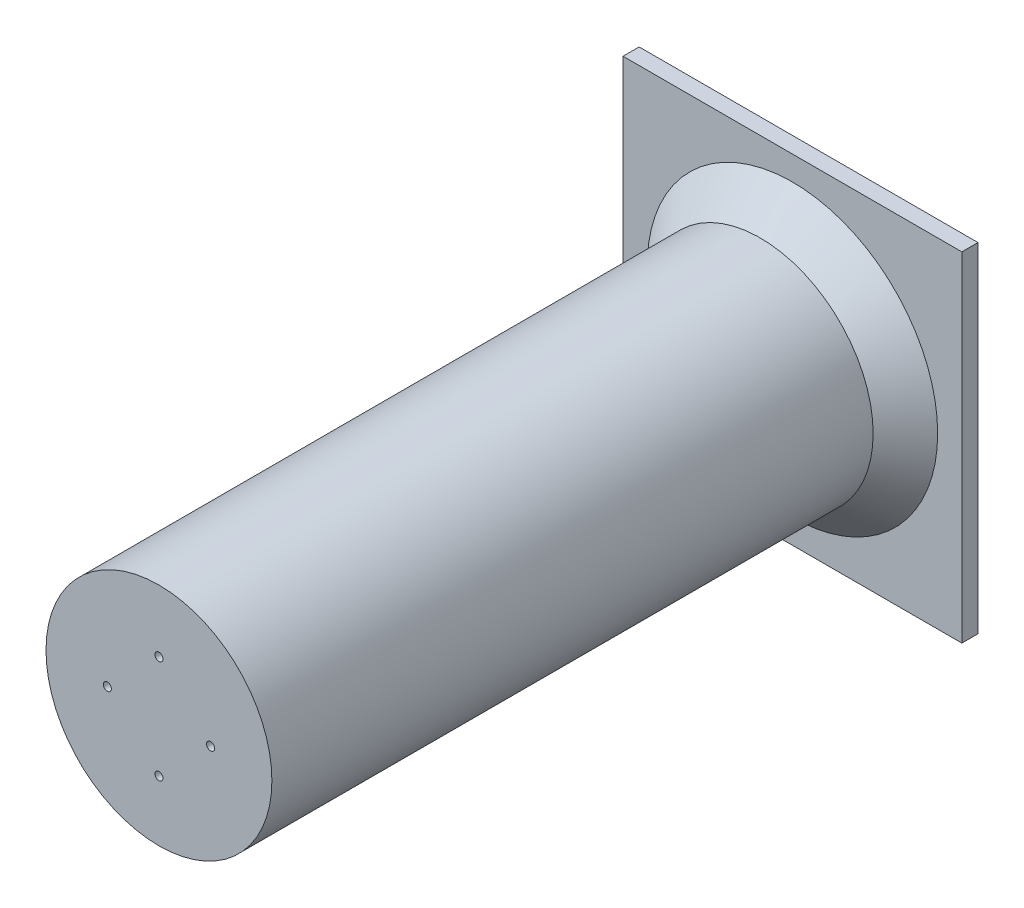
ISO-10303-21;
HEADER;
FILE_DESCRIPTION(('STEP AP214'),'2;1');
FILE_NAME('part.step','',(''),(''),'','','');
FILE_SCHEMA(('AUTOMOTIVE_DESIGN { 1 0 10303 214 1 1 1 1 }'));
ENDSEC;
DATA;
#1=APPLICATION_CONTEXT('core data for automotive mechanical design processes');
#2=APPLICATION_PROTOCOL_DEFINITION('international standard','automotive_design',2000,#1);
#3=PRODUCT_CONTEXT('',#1,'mechanical');
#4=PRODUCT('Part','Part','',(#3));
#5=PRODUCT_RELATED_PRODUCT_CATEGORY('part','',(#4));
#6=PRODUCT_DEFINITION_FORMATION('','',#4);
#7=PRODUCT_DEFINITION_CONTEXT('part definition',#1,'design');
#8=PRODUCT_DEFINITION('design','',#6,#7);
#9=PRODUCT_DEFINITION_SHAPE('','',#8);
#10=(LENGTH_UNIT() NAMED_UNIT(*) SI_UNIT(.MILLI.,.METRE.));
#11=(NAMED_UNIT(*) PLANE_ANGLE_UNIT() SI_UNIT($,.RADIAN.));
#12=(NAMED_UNIT(*) SI_UNIT($,.STERADIAN.) SOLID_ANGLE_UNIT());
#13=UNCERTAINTY_MEASURE_WITH_UNIT(LENGTH_MEASURE(1.E-05),#10,'distance_accuracy_value','');
#14=(GEOMETRIC_REPRESENTATION_CONTEXT(3) GLOBAL_UNCERTAINTY_ASSIGNED_CONTEXT((#13)) GLOBAL_UNIT_ASSIGNED_CONTEXT((#10,
#11,#12)) REPRESENTATION_CONTEXT('',''));
#15=CARTESIAN_POINT('',(0.,0.,0.));
#16=DIRECTION('',(0.,0.,1.));
#17=DIRECTION('',(1.,0.,0.));
#18=AXIS2_PLACEMENT_3D('',#15,#16,#17);
#19=CARTESIAN_POINT('',(-13.4317068131869,0.262679999999987,-196.5));
#20=DIRECTION('',(0.,0.,-1.));
#21=DIRECTION('',(-1.,0.,0.));
#22=AXIS2_PLACEMENT_3D('',#19,#20,#21);
#23=CONICAL_SURFACE('',#22,45.,0.785398163397448);
#24=CARTESIAN_POINT('',(-13.4317068131869,0.262679999999987,-196.5));
#25=DIRECTION('',(0.,0.,1.));
#26=DIRECTION('',(1.,0.,0.));
#27=AXIS2_PLACEMENT_3D('',#24,#25,#26);
#28=CIRCLE('',#27,45.);
#29=CARTESIAN_POINT('',(31.5682931868131,0.262679999999987,-196.5));
#30=VERTEX_POINT('',#29);
#31=EDGE_CURVE('E12',#30,#30,#28,.F.);
#32=ORIENTED_EDGE('',*,*,#31,.F.);
#33=EDGE_LOOP('',(#32));
#34=FACE_BOUND('',#33,.T.);
#35=CARTESIAN_POINT('',(-13.4317068131869,0.262679999999987,-186.5));
#36=DIRECTION('',(0.,0.,1.));
#37=DIRECTION('',(1.,0.,0.));
#38=AXIS2_PLACEMENT_3D('',#35,#36,#37);
#39=CIRCLE('',#38,35.);
#40=CARTESIAN_POINT('',(21.5682931868131,0.262679999999987,-186.5));
#41=VERTEX_POINT('',#40);
#42=EDGE_CURVE('E126',#41,#41,#39,.T.);
#43=ORIENTED_EDGE('',*,*,#42,.F.);
#44=EDGE_LOOP('',(#43));
#45=FACE_BOUND('',#44,.T.);
#46=ADVANCED_FACE('F49',(#34,#45),#23,.T.);
#47=CARTESIAN_POINT('',(-13.4317068131869,0.262679999999987,-196.5));
#48=DIRECTION('',(0.,0.,1.));
#49=DIRECTION('',(1.,0.,0.));
#50=AXIS2_PLACEMENT_3D('',#47,#48,#49);
#51=CYLINDRICAL_SURFACE('',#50,35.);
#52=CARTESIAN_POINT('',(-13.4317068131869,0.262679999999987,-0.186209333673831));
#53=DIRECTION('',(0.,0.,-1.));
#54=DIRECTION('',(-1.,0.,0.));
#55=AXIS2_PLACEMENT_3D('',#52,#53,#54);
#56=CIRCLE('',#55,35.);
#57=CARTESIAN_POINT('',(-48.431706813187,0.262679999999987,-0.186209333673831));
#58=VERTEX_POINT('',#57);
#59=EDGE_CURVE('E137',#58,#58,#56,.T.);
#60=ORIENTED_EDGE('',*,*,#59,.T.);
#61=EDGE_LOOP('',(#60));
#62=FACE_BOUND('',#61,.T.);
#63=ORIENTED_EDGE('',*,*,#42,.T.);
#64=EDGE_LOOP('',(#63));
#65=FACE_BOUND('',#64,.T.);
#66=ADVANCED_FACE('F170',(#62,#65),#51,.T.);
#67=CARTESIAN_POINT('',(-65.9317068131869,-52.23732,-201.5));
#68=DIRECTION('',(1.,0.,0.));
#69=DIRECTION('',(0.,0.,-1.));
#70=AXIS2_PLACEMENT_3D('',#67,#68,#69);
#71=PLANE('',#70);
#72=DIRECTION('',(0.,1.,0.));
#73=VECTOR('',#72,1.);
#74=CARTESIAN_POINT('',(-65.9317068131869,-52.23732,-196.5));
#75=LINE('',#74,#73);
#76=CARTESIAN_POINT('',(-65.9317068131869,-52.23732,-196.5));
#77=VERTEX_POINT('',#76);
#78=CARTESIAN_POINT('',(-65.9317068131869,52.76268,-196.5));
#79=VERTEX_POINT('',#78);
#80=EDGE_CURVE('E123',#77,#79,#75,.T.);
#81=ORIENTED_EDGE('',*,*,#80,.T.);
#82=DIRECTION('',(0.,0.,1.));
#83=VECTOR('',#82,1.);
#84=CARTESIAN_POINT('',(-65.9317068131869,52.76268,-201.5));
#85=LINE('',#84,#83);
#86=CARTESIAN_POINT('',(-65.9317068131869,52.76268,-201.5));
#87=VERTEX_POINT('',#86);
#88=EDGE_CURVE('E106',#87,#79,#85,.T.);
#89=ORIENTED_EDGE('',*,*,#88,.F.);
#90=DIRECTION('',(0.,1.,0.));
#91=VECTOR('',#90,1.);
#92=CARTESIAN_POINT('',(-65.9317068131869,-52.23732,-201.5));
#93=LINE('',#92,#91);
#94=CARTESIAN_POINT('',(-65.9317068131869,-52.23732,-201.5));
#95=VERTEX_POINT('',#94);
#96=EDGE_CURVE('E133',#95,#87,#93,.T.);
#97=ORIENTED_EDGE('',*,*,#96,.F.);
#98=DIRECTION('',(0.,0.,1.));
#99=VECTOR('',#98,1.);
#100=CARTESIAN_POINT('',(-65.9317068131869,-52.23732,-201.5));
#101=LINE('',#100,#99);
#102=EDGE_CURVE('E109',#95,#77,#101,.T.);
#103=ORIENTED_EDGE('',*,*,#102,.T.);
#104=EDGE_LOOP('',(#81,#89,#97,#103));
#105=FACE_BOUND('',#104,.T.);
#106=ADVANCED_FACE('F173',(#105),#71,.F.);
#107=CARTESIAN_POINT('',(39.0682931868131,52.76268,-201.5));
#108=DIRECTION('',(0.,-1.,0.));
#109=DIRECTION('',(0.,0.,-1.));
#110=AXIS2_PLACEMENT_3D('',#107,#108,#109);
#111=PLANE('',#110);
#112=DIRECTION('',(1.,0.,0.));
#113=VECTOR('',#112,1.);
#114=CARTESIAN_POINT('',(39.0682931868131,52.76268,-196.5));
#115=LINE('',#114,#113);
#116=CARTESIAN_POINT('',(39.0682931868131,52.76268,-196.5));
#117=VERTEX_POINT('',#116);
#118=EDGE_CURVE('E69',#79,#117,#115,.T.);
#119=ORIENTED_EDGE('',*,*,#118,.T.);
#120=DIRECTION('',(0.,0.,1.));
#121=VECTOR('',#120,1.);
#122=CARTESIAN_POINT('',(39.0682931868131,52.76268,-201.5));
#123=LINE('',#122,#121);
#124=CARTESIAN_POINT('',(39.0682931868131,52.76268,-201.5));
#125=VERTEX_POINT('',#124);
#126=EDGE_CURVE('E103',#125,#117,#123,.T.);
#127=ORIENTED_EDGE('',*,*,#126,.F.);
#128=DIRECTION('',(1.,0.,0.));
#129=VECTOR('',#128,1.);
#130=CARTESIAN_POINT('',(39.0682931868131,52.76268,-201.5));
#131=LINE('',#130,#129);
#132=EDGE_CURVE('E85',#87,#125,#131,.T.);
#133=ORIENTED_EDGE('',*,*,#132,.F.);
#134=ORIENTED_EDGE('',*,*,#88,.T.);
#135=EDGE_LOOP('',(#119,#127,#133,#134));
#136=FACE_BOUND('',#135,.T.);
#137=ADVANCED_FACE('F102',(#136),#111,.F.);
#138=CARTESIAN_POINT('',(39.0682931868131,-52.23732,-201.5));
#139=DIRECTION('',(-1.,0.,0.));
#140=DIRECTION('',(0.,0.,1.));
#141=AXIS2_PLACEMENT_3D('',#138,#139,#140);
#142=PLANE('',#141);
#143=DIRECTION('',(0.,-1.,0.));
#144=VECTOR('',#143,1.);
#145=CARTESIAN_POINT('',(39.0682931868131,-52.23732,-196.5));
#146=LINE('',#145,#144);
#147=CARTESIAN_POINT('',(39.0682931868131,-52.23732,-196.5));
#148=VERTEX_POINT('',#147);
#149=EDGE_CURVE('E100',#117,#148,#146,.T.);
#150=ORIENTED_EDGE('',*,*,#149,.T.);
#151=DIRECTION('',(0.,0.,1.));
#152=VECTOR('',#151,1.);
#153=CARTESIAN_POINT('',(39.0682931868131,-52.23732,-201.5));
#154=LINE('',#153,#152);
#155=CARTESIAN_POINT('',(39.0682931868131,-52.23732,-201.5));
#156=VERTEX_POINT('',#155);
#157=EDGE_CURVE('E136',#156,#148,#154,.T.);
#158=ORIENTED_EDGE('',*,*,#157,.F.);
#159=DIRECTION('',(0.,-1.,0.));
#160=VECTOR('',#159,1.);
#161=CARTESIAN_POINT('',(39.0682931868131,-52.23732,-201.5));
#162=LINE('',#161,#160);
#163=EDGE_CURVE('E112',#125,#156,#162,.T.);
#164=ORIENTED_EDGE('',*,*,#163,.F.);
#165=ORIENTED_EDGE('',*,*,#126,.T.);
#166=EDGE_LOOP('',(#150,#158,#164,#165));
#167=FACE_BOUND('',#166,.T.);
#168=ADVANCED_FACE('F111',(#167),#142,.F.);
#169=CARTESIAN_POINT('',(39.0682931868131,-52.23732,-201.5));
#170=DIRECTION('',(0.,1.,0.));
#171=DIRECTION('',(0.,0.,1.));
#172=AXIS2_PLACEMENT_3D('',#169,#170,#171);
#173=PLANE('',#172);
#174=DIRECTION('',(-1.,0.,0.));
#175=VECTOR('',#174,1.);
#176=CARTESIAN_POINT('',(39.0682931868131,-52.23732,-196.5));
#177=LINE('',#176,#175);
#178=EDGE_CURVE('E94',#148,#77,#177,.T.);
#179=ORIENTED_EDGE('',*,*,#178,.T.);
#180=ORIENTED_EDGE('',*,*,#102,.F.);
#181=DIRECTION('',(-1.,0.,0.));
#182=VECTOR('',#181,1.);
#183=CARTESIAN_POINT('',(39.0682931868131,-52.23732,-201.5));
#184=LINE('',#183,#182);
#185=EDGE_CURVE('E60',#156,#95,#184,.T.);
#186=ORIENTED_EDGE('',*,*,#185,.F.);
#187=ORIENTED_EDGE('',*,*,#157,.T.);
#188=EDGE_LOOP('',(#179,#180,#186,#187));
#189=FACE_BOUND('',#188,.T.);
#190=ADVANCED_FACE('F189',(#189),#173,.F.);
#191=CARTESIAN_POINT('',(0.,0.,-201.5));
#192=DIRECTION('',(0.,0.,1.));
#193=DIRECTION('',(1.,0.,0.));
#194=AXIS2_PLACEMENT_3D('',#191,#192,#193);
#195=PLANE('',#194);
#196=ORIENTED_EDGE('',*,*,#96,.T.);
#197=ORIENTED_EDGE('',*,*,#132,.T.);
#198=ORIENTED_EDGE('',*,*,#163,.T.);
#199=ORIENTED_EDGE('',*,*,#185,.T.);
#200=EDGE_LOOP('',(#196,#197,#198,#199));
#201=FACE_BOUND('',#200,.T.);
#202=ADVANCED_FACE('F190',(#201),#195,.F.);
#203=CARTESIAN_POINT('',(0.,0.,-196.5));
#204=DIRECTION('',(0.,0.,1.));
#205=DIRECTION('',(1.,0.,0.));
#206=AXIS2_PLACEMENT_3D('',#203,#204,#205);
#207=PLANE('',#206);
#208=ORIENTED_EDGE('',*,*,#31,.T.);
#209=EDGE_LOOP('',(#208));
#210=FACE_BOUND('',#209,.T.);
#211=ORIENTED_EDGE('',*,*,#80,.F.);
#212=ORIENTED_EDGE('',*,*,#178,.F.);
#213=ORIENTED_EDGE('',*,*,#149,.F.);
#214=ORIENTED_EDGE('',*,*,#118,.F.);
#215=EDGE_LOOP('',(#211,#212,#213,#214));
#216=FACE_BOUND('',#215,.T.);
#217=ADVANCED_FACE('F115',(#210,#216),#207,.T.);
#218=CARTESIAN_POINT('',(131.468293186813,-97.23732,-0.186209333673831));
#219=DIRECTION('',(0.,0.,-1.));
#220=DIRECTION('',(-1.,0.,0.));
#221=AXIS2_PLACEMENT_3D('',#218,#219,#220);
#222=PLANE('',#221);
#223=CARTESIAN_POINT('',(-29.4317068131869,0.,-0.186209333673831));
#224=DIRECTION('',(0.,0.,-1.));
#225=DIRECTION('',(-1.,0.,0.));
#226=AXIS2_PLACEMENT_3D('',#223,#224,#225);
#227=CIRCLE('',#226,1.25);
#228=CARTESIAN_POINT('',(-30.681706813187,0.,-0.186209333673831));
#229=VERTEX_POINT('',#228);
#230=EDGE_CURVE('E53',#229,#229,#227,.F.);
#231=ORIENTED_EDGE('',*,*,#230,.F.);
#232=EDGE_LOOP('',(#231));
#233=FACE_BOUND('',#232,.T.);
#234=CARTESIAN_POINT('',(-13.4317068131869,16.,-0.186209333673831));
#235=DIRECTION('',(0.,0.,-1.));
#236=DIRECTION('',(-1.,0.,0.));
#237=AXIS2_PLACEMENT_3D('',#234,#235,#236);
#238=CIRCLE('',#237,1.25);
#239=CARTESIAN_POINT('',(-14.6817068131869,16.,-0.186209333673831));
#240=VERTEX_POINT('',#239);
#241=EDGE_CURVE('E149',#240,#240,#238,.F.);
#242=ORIENTED_EDGE('',*,*,#241,.F.);
#243=EDGE_LOOP('',(#242));
#244=FACE_BOUND('',#243,.T.);
#245=CARTESIAN_POINT('',(2.56829318681305,-1.09767967964345E-13,-0.186209333673831));
#246=DIRECTION('',(0.,0.,-1.));
#247=DIRECTION('',(-1.,0.,0.));
#248=AXIS2_PLACEMENT_3D('',#245,#246,#247);
#249=CIRCLE('',#248,1.25);
#250=CARTESIAN_POINT('',(1.31829318681305,-1.09767967964345E-13,-0.186209333673831));
#251=VERTEX_POINT('',#250);
#252=EDGE_CURVE('E145',#251,#251,#249,.F.);
#253=ORIENTED_EDGE('',*,*,#252,.F.);
#254=EDGE_LOOP('',(#253));
#255=FACE_BOUND('',#254,.T.);
#256=CARTESIAN_POINT('',(-13.4317068131871,-16.,-0.186209333673831));
#257=DIRECTION('',(0.,0.,-1.));
#258=DIRECTION('',(-1.,0.,0.));
#259=AXIS2_PLACEMENT_3D('',#256,#257,#258);
#260=CIRCLE('',#259,1.25);
#261=CARTESIAN_POINT('',(-14.6817068131871,-16.,-0.186209333673831));
#262=VERTEX_POINT('',#261);
#263=EDGE_CURVE('E141',#262,#262,#260,.F.);
#264=ORIENTED_EDGE('',*,*,#263,.F.);
#265=EDGE_LOOP('',(#264));
#266=FACE_BOUND('',#265,.T.);
#267=ORIENTED_EDGE('',*,*,#59,.F.);
#268=EDGE_LOOP('',(#267));
#269=FACE_BOUND('',#268,.T.);
#270=ADVANCED_FACE('F51',(#233,#244,#255,#266,#269),#222,.F.);
#271=CARTESIAN_POINT('',(-13.4317068131871,-16.,-0.186197333673831));
#272=DIRECTION('',(0.,0.,-1.));
#273=DIRECTION('',(-1.,0.,0.));
#274=AXIS2_PLACEMENT_3D('',#271,#272,#273);
#275=CYLINDRICAL_SURFACE('',#274,1.25);
#276=CARTESIAN_POINT('',(-13.4317068131871,-16.,-15.1862093336738));
#277=DIRECTION('',(0.,0.,1.));
#278=DIRECTION('',(1.,0.,0.));
#279=AXIS2_PLACEMENT_3D('',#276,#277,#278);
#280=CIRCLE('',#279,1.25);
#281=CARTESIAN_POINT('',(-14.6817068131871,-16.,-15.1862093336738));
#282=VERTEX_POINT('',#281);
#283=EDGE_CURVE('E181',#282,#282,#280,.T.);
#284=CARTESIAN_POINT('',(-14.6817068131871,-16.,-15.1862093336738));
#285=CARTESIAN_POINT('',(-14.6817068131871,-16.,-15.0299593336738));
#286=CARTESIAN_POINT('',(-14.6817068131871,-16.,-14.8737093336738));
#287=CARTESIAN_POINT('',(-14.6817068131871,-16.,-14.5612093336738));
#288=CARTESIAN_POINT('',(-14.6817068131871,-16.,-14.4049593336738));
#289=CARTESIAN_POINT('',(-14.6817068131871,-16.,-14.0924593336738));
#290=CARTESIAN_POINT('',(-14.6817068131871,-16.,-13.9362093336738));
#291=CARTESIAN_POINT('',(-14.6817068131871,-16.,-13.6237093336738));
#292=CARTESIAN_POINT('',(-14.6817068131871,-16.,-13.4674593336738));
#293=CARTESIAN_POINT('',(-14.6817068131871,-16.,-13.1549593336738));
#294=CARTESIAN_POINT('',(-14.6817068131871,-16.,-12.9987093336738));
#295=CARTESIAN_POINT('',(-14.6817068131871,-16.,-12.6862093336738));
#296=CARTESIAN_POINT('',(-14.6817068131871,-16.,-12.5299593336738));
#297=CARTESIAN_POINT('',(-14.6817068131871,-16.,-12.2174593336738));
#298=CARTESIAN_POINT('',(-14.6817068131871,-16.,-12.0612093336738));
#299=CARTESIAN_POINT('',(-14.6817068131871,-16.,-11.7487093336738));
#300=CARTESIAN_POINT('',(-14.6817068131871,-16.,-11.5924593336738));
#301=CARTESIAN_POINT('',(-14.6817068131871,-16.,-11.2799593336738));
#302=CARTESIAN_POINT('',(-14.6817068131871,-16.,-11.1237093336738));
#303=CARTESIAN_POINT('',(-14.6817068131871,-16.,-10.8112093336738));
#304=CARTESIAN_POINT('',(-14.6817068131871,-16.,-10.6549593336738));
#305=CARTESIAN_POINT('',(-14.6817068131871,-16.,-10.3424593336738));
#306=CARTESIAN_POINT('',(-14.6817068131871,-16.,-10.1862093336738));
#307=CARTESIAN_POINT('',(-14.6817068131871,-16.,-9.87370933367383));
#308=CARTESIAN_POINT('',(-14.6817068131871,-16.,-9.71745933367383));
#309=CARTESIAN_POINT('',(-14.6817068131871,-16.,-9.40495933367383));
#310=CARTESIAN_POINT('',(-14.6817068131871,-16.,-9.24870933367383));
#311=CARTESIAN_POINT('',(-14.6817068131871,-16.,-8.93620933367383));
#312=CARTESIAN_POINT('',(-14.6817068131871,-16.,-8.77995933367383));
#313=CARTESIAN_POINT('',(-14.6817068131871,-16.,-8.46745933367383));
#314=CARTESIAN_POINT('',(-14.6817068131871,-16.,-8.31120933367383));
#315=CARTESIAN_POINT('',(-14.6817068131871,-16.,-7.99870933367383));
#316=CARTESIAN_POINT('',(-14.6817068131871,-16.,-7.84245933367383));
#317=CARTESIAN_POINT('',(-14.6817068131871,-16.,-7.52995933367383));
#318=CARTESIAN_POINT('',(-14.6817068131871,-16.,-7.37370933367383));
#319=CARTESIAN_POINT('',(-14.6817068131871,-16.,-7.06120933367383));
#320=CARTESIAN_POINT('',(-14.6817068131871,-16.,-6.90495933367383));
#321=CARTESIAN_POINT('',(-14.6817068131871,-16.,-6.59245933367383));
#322=CARTESIAN_POINT('',(-14.6817068131871,-16.,-6.43620933367383));
#323=CARTESIAN_POINT('',(-14.6817068131871,-16.,-6.12370933367383));
#324=CARTESIAN_POINT('',(-14.6817068131871,-16.,-5.96745933367383));
#325=CARTESIAN_POINT('',(-14.6817068131871,-16.,-5.65495933367383));
#326=CARTESIAN_POINT('',(-14.6817068131871,-16.,-5.49870933367383));
#327=CARTESIAN_POINT('',(-14.6817068131871,-16.,-5.18620933367383));
#328=CARTESIAN_POINT('',(-14.6817068131871,-16.,-5.02995933367383));
#329=CARTESIAN_POINT('',(-14.6817068131871,-16.,-4.71745933367383));
#330=CARTESIAN_POINT('',(-14.6817068131871,-16.,-4.56120933367383));
#331=CARTESIAN_POINT('',(-14.6817068131871,-16.,-4.24870933367383));
#332=CARTESIAN_POINT('',(-14.6817068131871,-16.,-4.09245933367383));
#333=CARTESIAN_POINT('',(-14.6817068131871,-16.,-3.77995933367383));
#334=CARTESIAN_POINT('',(-14.6817068131871,-16.,-3.62370933367383));
#335=CARTESIAN_POINT('',(-14.6817068131871,-16.,-3.31120933367383));
#336=CARTESIAN_POINT('',(-14.6817068131871,-16.,-3.15495933367383));
#337=CARTESIAN_POINT('',(-14.6817068131871,-16.,-2.84245933367383));
#338=CARTESIAN_POINT('',(-14.6817068131871,-16.,-2.68620933367383));
#339=CARTESIAN_POINT('',(-14.6817068131871,-16.,-2.37370933367383));
#340=CARTESIAN_POINT('',(-14.6817068131871,-16.,-2.21745933367383));
#341=CARTESIAN_POINT('',(-14.6817068131871,-16.,-1.90495933367383));
#342=CARTESIAN_POINT('',(-14.6817068131871,-16.,-1.74870933367383));
#343=CARTESIAN_POINT('',(-14.6817068131871,-16.,-1.43620933367383));
#344=CARTESIAN_POINT('',(-14.6817068131871,-16.,-1.27995933367383));
#345=CARTESIAN_POINT('',(-14.6817068131871,-16.,-0.967459333673832));
#346=CARTESIAN_POINT('',(-14.6817068131871,-16.,-0.811209333673832));
#347=CARTESIAN_POINT('',(-14.6817068131871,-16.,-0.498709333673832));
#348=CARTESIAN_POINT('',(-14.6817068131871,-16.,-0.342459333673832));
#349=CARTESIAN_POINT('',(-14.6817068131871,-16.,-0.186209333673832));
#350=B_SPLINE_CURVE_WITH_KNOTS('',3,(#284,#285,#286,#287,#288,#289,#290,#291,#292,#293,#294,
#295,#296,#297,#298,#299,#300,#301,#302,#303,#304,#305,#306,#307,#308,#309,#310,#311,#312,#313,
#314,#315,#316,#317,#318,#319,#320,#321,#322,#323,#324,#325,#326,#327,#328,#329,#330,#331,#332,
#333,#334,#335,#336,#337,#338,#339,#340,#341,#342,#343,#344,#345,#346,#347,#348,#349),
.UNSPECIFIED.,.F.,.F.,(4,2,2,2,2,2,2,2,2,2,2,2,2,2,2,2,2,2,2,2,2,2,2,2,2,2,2,2,2,2,2,2,4),(0.,
0.46875,0.937500000000001,1.40625,1.875,2.34375,2.8125,3.28125,3.75,4.21875,4.6875,5.15625,
5.625,6.09375,6.5625,7.03125,7.5,7.96875,8.4375,8.90625,9.375,9.84375,10.3125,10.78125,11.25,
11.71875,12.1875,12.65625,13.125,13.59375,14.0625,14.53125,15.),.UNSPECIFIED.);
#351=EDGE_CURVE('BSEAM162',#282,#262,#350,.T.);
#352=ORIENTED_EDGE('',*,*,#283,.F.);
#353=ORIENTED_EDGE('',*,*,#263,.T.);
#354=ORIENTED_EDGE('',*,*,#351,.T.);
#355=ORIENTED_EDGE('',*,*,#351,.F.);
#356=EDGE_LOOP('',(#352,#354,#353,#355));
#357=FACE_BOUND('',#356,.T.);
#358=ADVANCED_FACE('F162',(#357),#275,.F.);
#359=CARTESIAN_POINT('',(-13.4317068131871,-16.,-15.1862093336738));
#360=DIRECTION('',(0.,0.,1.));
#361=DIRECTION('',(1.,0.,0.));
#362=AXIS2_PLACEMENT_3D('',#359,#360,#361);
#363=PLANE('',#362);
#364=ORIENTED_EDGE('',*,*,#283,.T.);
#365=EDGE_LOOP('',(#364));
#366=FACE_BOUND('',#365,.T.);
#367=ADVANCED_FACE('F209',(#366),#363,.T.);
#368=CARTESIAN_POINT('',(2.56829318681305,-1.09767967964345E-13,-0.186197333673831));
#369=DIRECTION('',(0.,0.,-1.));
#370=DIRECTION('',(-1.,0.,0.));
#371=AXIS2_PLACEMENT_3D('',#368,#369,#370);
#372=CYLINDRICAL_SURFACE('',#371,1.25);
#373=CARTESIAN_POINT('',(2.56829318681305,-1.09767967964345E-13,-15.1862093336738));
#374=DIRECTION('',(0.,0.,1.));
#375=DIRECTION('',(1.,0.,0.));
#376=AXIS2_PLACEMENT_3D('',#373,#374,#375);
#377=CIRCLE('',#376,1.25);
#378=CARTESIAN_POINT('',(1.31829318681305,-1.09767967964345E-13,-15.1862093336738));
#379=VERTEX_POINT('',#378);
#380=EDGE_CURVE('E328',#379,#379,#377,.T.);
#381=CARTESIAN_POINT('',(1.31829318681305,-1.09767967964345E-13,-15.1862093336738));
#382=CARTESIAN_POINT('',(1.31829318681305,-1.09767967964345E-13,-15.0299593336738));
#383=CARTESIAN_POINT('',(1.31829318681305,-1.09767967964345E-13,-14.8737093336738));
#384=CARTESIAN_POINT('',(1.31829318681305,-1.09767967964345E-13,-14.5612093336738));
#385=CARTESIAN_POINT('',(1.31829318681305,-1.09767967964345E-13,-14.4049593336738));
#386=CARTESIAN_POINT('',(1.31829318681305,-1.09767967964345E-13,-14.0924593336738));
#387=CARTESIAN_POINT('',(1.31829318681305,-1.09767967964345E-13,-13.9362093336738));
#388=CARTESIAN_POINT('',(1.31829318681305,-1.09767967964345E-13,-13.6237093336738));
#389=CARTESIAN_POINT('',(1.31829318681305,-1.09767967964345E-13,-13.4674593336738));
#390=CARTESIAN_POINT('',(1.31829318681305,-1.09767967964345E-13,-13.1549593336738));
#391=CARTESIAN_POINT('',(1.31829318681305,-1.09767967964345E-13,-12.9987093336738));
#392=CARTESIAN_POINT('',(1.31829318681305,-1.09767967964345E-13,-12.6862093336738));
#393=CARTESIAN_POINT('',(1.31829318681305,-1.09767967964345E-13,-12.5299593336738));
#394=CARTESIAN_POINT('',(1.31829318681305,-1.09767967964345E-13,-12.2174593336738));
#395=CARTESIAN_POINT('',(1.31829318681305,-1.09767967964345E-13,-12.0612093336738));
#396=CARTESIAN_POINT('',(1.31829318681305,-1.09767967964345E-13,-11.7487093336738));
#397=CARTESIAN_POINT('',(1.31829318681305,-1.09767967964345E-13,-11.5924593336738));
#398=CARTESIAN_POINT('',(1.31829318681305,-1.09767967964345E-13,-11.2799593336738));
#399=CARTESIAN_POINT('',(1.31829318681305,-1.09767967964345E-13,-11.1237093336738));
#400=CARTESIAN_POINT('',(1.31829318681305,-1.09767967964345E-13,-10.8112093336738));
#401=CARTESIAN_POINT('',(1.31829318681305,-1.09767967964345E-13,-10.6549593336738));
#402=CARTESIAN_POINT('',(1.31829318681305,-1.09767967964345E-13,-10.3424593336738));
#403=CARTESIAN_POINT('',(1.31829318681305,-1.09767967964345E-13,-10.1862093336738));
#404=CARTESIAN_POINT('',(1.31829318681305,-1.09767967964345E-13,-9.87370933367383));
#405=CARTESIAN_POINT('',(1.31829318681305,-1.09767967964345E-13,-9.71745933367383));
#406=CARTESIAN_POINT('',(1.31829318681305,-1.09767967964345E-13,-9.40495933367383));
#407=CARTESIAN_POINT('',(1.31829318681305,-1.09767967964345E-13,-9.24870933367383));
#408=CARTESIAN_POINT('',(1.31829318681305,-1.09767967964345E-13,-8.93620933367383));
#409=CARTESIAN_POINT('',(1.31829318681305,-1.09767967964345E-13,-8.77995933367383));
#410=CARTESIAN_POINT('',(1.31829318681305,-1.09767967964345E-13,-8.46745933367383));
#411=CARTESIAN_POINT('',(1.31829318681305,-1.09767967964345E-13,-8.31120933367383));
#412=CARTESIAN_POINT('',(1.31829318681305,-1.09767967964345E-13,-7.99870933367383));
#413=CARTESIAN_POINT('',(1.31829318681305,-1.09767967964345E-13,-7.84245933367383));
#414=CARTESIAN_POINT('',(1.31829318681305,-1.09767967964345E-13,-7.52995933367383));
#415=CARTESIAN_POINT('',(1.31829318681305,-1.09767967964345E-13,-7.37370933367383));
#416=CARTESIAN_POINT('',(1.31829318681305,-1.09767967964345E-13,-7.06120933367383));
#417=CARTESIAN_POINT('',(1.31829318681305,-1.09767967964345E-13,-6.90495933367383));
#418=CARTESIAN_POINT('',(1.31829318681305,-1.09767967964345E-13,-6.59245933367383));
#419=CARTESIAN_POINT('',(1.31829318681305,-1.09767967964345E-13,-6.43620933367383));
#420=CARTESIAN_POINT('',(1.31829318681305,-1.09767967964345E-13,-6.12370933367383));
#421=CARTESIAN_POINT('',(1.31829318681305,-1.09767967964345E-13,-5.96745933367383));
#422=CARTESIAN_POINT('',(1.31829318681305,-1.09767967964345E-13,-5.65495933367383));
#423=CARTESIAN_POINT('',(1.31829318681305,-1.09767967964345E-13,-5.49870933367383));
#424=CARTESIAN_POINT('',(1.31829318681305,-1.09767967964345E-13,-5.18620933367383));
#425=CARTESIAN_POINT('',(1.31829318681305,-1.09767967964345E-13,-5.02995933367383));
#426=CARTESIAN_POINT('',(1.31829318681305,-1.09767967964345E-13,-4.71745933367383));
#427=CARTESIAN_POINT('',(1.31829318681305,-1.09767967964345E-13,-4.56120933367383));
#428=CARTESIAN_POINT('',(1.31829318681305,-1.09767967964345E-13,-4.24870933367383));
#429=CARTESIAN_POINT('',(1.31829318681305,-1.09767967964345E-13,-4.09245933367383));
#430=CARTESIAN_POINT('',(1.31829318681305,-1.09767967964345E-13,-3.77995933367383));
#431=CARTESIAN_POINT('',(1.31829318681305,-1.09767967964345E-13,-3.62370933367383));
#432=CARTESIAN_POINT('',(1.31829318681305,-1.09767967964345E-13,-3.31120933367383));
#433=CARTESIAN_POINT('',(1.31829318681305,-1.09767967964345E-13,-3.15495933367383));
#434=CARTESIAN_POINT('',(1.31829318681305,-1.09767967964345E-13,-2.84245933367383));
#435=CARTESIAN_POINT('',(1.31829318681305,-1.09767967964345E-13,-2.68620933367383));
#436=CARTESIAN_POINT('',(1.31829318681305,-1.09767967964345E-13,-2.37370933367383));
#437=CARTESIAN_POINT('',(1.31829318681305,-1.09767967964345E-13,-2.21745933367383));
#438=CARTESIAN_POINT('',(1.31829318681305,-1.09767967964345E-13,-1.90495933367383));
#439=CARTESIAN_POINT('',(1.31829318681305,-1.09767967964345E-13,-1.74870933367383));
#440=CARTESIAN_POINT('',(1.31829318681305,-1.09767967964345E-13,-1.43620933367383));
#441=CARTESIAN_POINT('',(1.31829318681305,-1.09767967964345E-13,-1.27995933367383));
#442=CARTESIAN_POINT('',(1.31829318681305,-1.09767967964345E-13,-0.967459333673832));
#443=CARTESIAN_POINT('',(1.31829318681305,-1.09767967964345E-13,-0.811209333673832));
#444=CARTESIAN_POINT('',(1.31829318681305,-1.09767967964345E-13,-0.498709333673832));
#445=CARTESIAN_POINT('',(1.31829318681305,-1.09767967964345E-13,-0.342459333673832));
#446=CARTESIAN_POINT('',(1.31829318681305,-1.09767967964345E-13,-0.186209333673832));
#447=B_SPLINE_CURVE_WITH_KNOTS('',3,(#381,#382,#383,#384,#385,#386,#387,#388,#389,#390,#391,
#392,#393,#394,#395,#396,#397,#398,#399,#400,#401,#402,#403,#404,#405,#406,#407,#408,#409,#410,
#411,#412,#413,#414,#415,#416,#417,#418,#419,#420,#421,#422,#423,#424,#425,#426,#427,#428,#429,
#430,#431,#432,#433,#434,#435,#436,#437,#438,#439,#440,#441,#442,#443,#444,#445,#446),
.UNSPECIFIED.,.F.,.F.,(4,2,2,2,2,2,2,2,2,2,2,2,2,2,2,2,2,2,2,2,2,2,2,2,2,2,2,2,2,2,2,2,4),(0.,
0.46875,0.937500000000001,1.40625,1.875,2.34375,2.8125,3.28125,3.75,4.21875,4.6875,5.15625,
5.625,6.09375,6.5625,7.03125,7.5,7.96875,8.4375,8.90625,9.375,9.84375,10.3125,10.78125,11.25,
11.71875,12.1875,12.65625,13.125,13.59375,14.0625,14.53125,15.),.UNSPECIFIED.);
#448=EDGE_CURVE('BSEAM260',#379,#251,#447,.T.);
#449=ORIENTED_EDGE('',*,*,#380,.F.);
#450=ORIENTED_EDGE('',*,*,#252,.T.);
#451=ORIENTED_EDGE('',*,*,#448,.T.);
#452=ORIENTED_EDGE('',*,*,#448,.F.);
#453=EDGE_LOOP('',(#449,#451,#450,#452));
#454=FACE_BOUND('',#453,.T.);
#455=ADVANCED_FACE('F260',(#454),#372,.F.);
#456=CARTESIAN_POINT('',(2.56829318681305,-1.09767967964345E-13,-15.1862093336738));
#457=DIRECTION('',(0.,0.,1.));
#458=DIRECTION('',(1.,0.,0.));
#459=AXIS2_PLACEMENT_3D('',#456,#457,#458);
#460=PLANE('',#459);
#461=ORIENTED_EDGE('',*,*,#380,.T.);
#462=EDGE_LOOP('',(#461));
#463=FACE_BOUND('',#462,.T.);
#464=ADVANCED_FACE('F269',(#463),#460,.T.);
#465=CARTESIAN_POINT('',(-13.4317068131869,16.,-0.186197333673831));
#466=DIRECTION('',(0.,0.,-1.));
#467=DIRECTION('',(-1.,0.,0.));
#468=AXIS2_PLACEMENT_3D('',#465,#466,#467);
#469=CYLINDRICAL_SURFACE('',#468,1.25);
#470=CARTESIAN_POINT('',(-13.4317068131869,16.,-15.1862093336738));
#471=DIRECTION('',(0.,0.,1.));
#472=DIRECTION('',(1.,0.,0.));
#473=AXIS2_PLACEMENT_3D('',#470,#471,#472);
#474=CIRCLE('',#473,1.25);
#475=CARTESIAN_POINT('',(-14.6817068131869,16.,-15.1862093336738));
#476=VERTEX_POINT('',#475);
#477=EDGE_CURVE('E324',#476,#476,#474,.T.);
#478=CARTESIAN_POINT('',(-14.6817068131869,16.,-15.1862093336738));
#479=CARTESIAN_POINT('',(-14.6817068131869,16.,-15.0299593336738));
#480=CARTESIAN_POINT('',(-14.6817068131869,16.,-14.8737093336738));
#481=CARTESIAN_POINT('',(-14.6817068131869,16.,-14.5612093336738));
#482=CARTESIAN_POINT('',(-14.6817068131869,16.,-14.4049593336738));
#483=CARTESIAN_POINT('',(-14.6817068131869,16.,-14.0924593336738));
#484=CARTESIAN_POINT('',(-14.6817068131869,16.,-13.9362093336738));
#485=CARTESIAN_POINT('',(-14.6817068131869,16.,-13.6237093336738));
#486=CARTESIAN_POINT('',(-14.6817068131869,16.,-13.4674593336738));
#487=CARTESIAN_POINT('',(-14.6817068131869,16.,-13.1549593336738));
#488=CARTESIAN_POINT('',(-14.6817068131869,16.,-12.9987093336738));
#489=CARTESIAN_POINT('',(-14.6817068131869,16.,-12.6862093336738));
#490=CARTESIAN_POINT('',(-14.6817068131869,16.,-12.5299593336738));
#491=CARTESIAN_POINT('',(-14.6817068131869,16.,-12.2174593336738));
#492=CARTESIAN_POINT('',(-14.6817068131869,16.,-12.0612093336738));
#493=CARTESIAN_POINT('',(-14.6817068131869,16.,-11.7487093336738));
#494=CARTESIAN_POINT('',(-14.6817068131869,16.,-11.5924593336738));
#495=CARTESIAN_POINT('',(-14.6817068131869,16.,-11.2799593336738));
#496=CARTESIAN_POINT('',(-14.6817068131869,16.,-11.1237093336738));
#497=CARTESIAN_POINT('',(-14.6817068131869,16.,-10.8112093336738));
#498=CARTESIAN_POINT('',(-14.6817068131869,16.,-10.6549593336738));
#499=CARTESIAN_POINT('',(-14.6817068131869,16.,-10.3424593336738));
#500=CARTESIAN_POINT('',(-14.6817068131869,16.,-10.1862093336738));
#501=CARTESIAN_POINT('',(-14.6817068131869,16.,-9.87370933367383));
#502=CARTESIAN_POINT('',(-14.6817068131869,16.,-9.71745933367383));
#503=CARTESIAN_POINT('',(-14.6817068131869,16.,-9.40495933367383));
#504=CARTESIAN_POINT('',(-14.6817068131869,16.,-9.24870933367383));
#505=CARTESIAN_POINT('',(-14.6817068131869,16.,-8.93620933367383));
#506=CARTESIAN_POINT('',(-14.6817068131869,16.,-8.77995933367383));
#507=CARTESIAN_POINT('',(-14.6817068131869,16.,-8.46745933367383));
#508=CARTESIAN_POINT('',(-14.6817068131869,16.,-8.31120933367383));
#509=CARTESIAN_POINT('',(-14.6817068131869,16.,-7.99870933367383));
#510=CARTESIAN_POINT('',(-14.6817068131869,16.,-7.84245933367383));
#511=CARTESIAN_POINT('',(-14.6817068131869,16.,-7.52995933367383));
#512=CARTESIAN_POINT('',(-14.6817068131869,16.,-7.37370933367383));
#513=CARTESIAN_POINT('',(-14.6817068131869,16.,-7.06120933367383));
#514=CARTESIAN_POINT('',(-14.6817068131869,16.,-6.90495933367383));
#515=CARTESIAN_POINT('',(-14.6817068131869,16.,-6.59245933367383));
#516=CARTESIAN_POINT('',(-14.6817068131869,16.,-6.43620933367383));
#517=CARTESIAN_POINT('',(-14.6817068131869,16.,-6.12370933367383));
#518=CARTESIAN_POINT('',(-14.6817068131869,16.,-5.96745933367383));
#519=CARTESIAN_POINT('',(-14.6817068131869,16.,-5.65495933367383));
#520=CARTESIAN_POINT('',(-14.6817068131869,16.,-5.49870933367383));
#521=CARTESIAN_POINT('',(-14.6817068131869,16.,-5.18620933367383));
#522=CARTESIAN_POINT('',(-14.6817068131869,16.,-5.02995933367383));
#523=CARTESIAN_POINT('',(-14.6817068131869,16.,-4.71745933367383));
#524=CARTESIAN_POINT('',(-14.6817068131869,16.,-4.56120933367383));
#525=CARTESIAN_POINT('',(-14.6817068131869,16.,-4.24870933367383));
#526=CARTESIAN_POINT('',(-14.6817068131869,16.,-4.09245933367383));
#527=CARTESIAN_POINT('',(-14.6817068131869,16.,-3.77995933367383));
#528=CARTESIAN_POINT('',(-14.6817068131869,16.,-3.62370933367383));
#529=CARTESIAN_POINT('',(-14.6817068131869,16.,-3.31120933367383));
#530=CARTESIAN_POINT('',(-14.6817068131869,16.,-3.15495933367383));
#531=CARTESIAN_POINT('',(-14.6817068131869,16.,-2.84245933367383));
#532=CARTESIAN_POINT('',(-14.6817068131869,16.,-2.68620933367383));
#533=CARTESIAN_POINT('',(-14.6817068131869,16.,-2.37370933367383));
#534=CARTESIAN_POINT('',(-14.6817068131869,16.,-2.21745933367383));
#535=CARTESIAN_POINT('',(-14.6817068131869,16.,-1.90495933367383));
#536=CARTESIAN_POINT('',(-14.6817068131869,16.,-1.74870933367383));
#537=CARTESIAN_POINT('',(-14.6817068131869,16.,-1.43620933367383));
#538=CARTESIAN_POINT('',(-14.6817068131869,16.,-1.27995933367383));
#539=CARTESIAN_POINT('',(-14.6817068131869,16.,-0.967459333673832));
#540=CARTESIAN_POINT('',(-14.6817068131869,16.,-0.811209333673832));
#541=CARTESIAN_POINT('',(-14.6817068131869,16.,-0.498709333673832));
#542=CARTESIAN_POINT('',(-14.6817068131869,16.,-0.342459333673832));
#543=CARTESIAN_POINT('',(-14.6817068131869,16.,-0.186209333673832));
#544=B_SPLINE_CURVE_WITH_KNOTS('',3,(#478,#479,#480,#481,#482,#483,#484,#485,#486,#487,#488,
#489,#490,#491,#492,#493,#494,#495,#496,#497,#498,#499,#500,#501,#502,#503,#504,#505,#506,#507,
#508,#509,#510,#511,#512,#513,#514,#515,#516,#517,#518,#519,#520,#521,#522,#523,#524,#525,#526,
#527,#528,#529,#530,#531,#532,#533,#534,#535,#536,#537,#538,#539,#540,#541,#542,#543),
.UNSPECIFIED.,.F.,.F.,(4,2,2,2,2,2,2,2,2,2,2,2,2,2,2,2,2,2,2,2,2,2,2,2,2,2,2,2,2,2,2,2,4),(0.,
0.46875,0.937500000000001,1.40625,1.875,2.34375,2.8125,3.28125,3.75,4.21875,4.6875,5.15625,
5.625,6.09375,6.5625,7.03125,7.5,7.96875,8.4375,8.90625,9.375,9.84375,10.3125,10.78125,11.25,
11.71875,12.1875,12.65625,13.125,13.59375,14.0625,14.53125,15.),.UNSPECIFIED.);
#545=EDGE_CURVE('BSEAM279',#476,#240,#544,.T.);
#546=ORIENTED_EDGE('',*,*,#477,.F.);
#547=ORIENTED_EDGE('',*,*,#241,.T.);
#548=ORIENTED_EDGE('',*,*,#545,.T.);
#549=ORIENTED_EDGE('',*,*,#545,.F.);
#550=EDGE_LOOP('',(#546,#548,#547,#549));
#551=FACE_BOUND('',#550,.T.);
#552=ADVANCED_FACE('F279',(#551),#469,.F.);
#553=CARTESIAN_POINT('',(-13.4317068131869,16.,-15.1862093336738));
#554=DIRECTION('',(0.,0.,1.));
#555=DIRECTION('',(1.,0.,0.));
#556=AXIS2_PLACEMENT_3D('',#553,#554,#555);
#557=PLANE('',#556);
#558=ORIENTED_EDGE('',*,*,#477,.T.);
#559=EDGE_LOOP('',(#558));
#560=FACE_BOUND('',#559,.T.);
#561=ADVANCED_FACE('F289',(#560),#557,.T.);
#562=CARTESIAN_POINT('',(-29.4317068131869,0.,-0.186197333673831));
#563=DIRECTION('',(0.,0.,-1.));
#564=DIRECTION('',(-1.,0.,0.));
#565=AXIS2_PLACEMENT_3D('',#562,#563,#564);
#566=CYLINDRICAL_SURFACE('',#565,1.25);
#567=CARTESIAN_POINT('',(-29.4317068131869,0.,-15.1862093336738));
#568=DIRECTION('',(0.,0.,1.));
#569=DIRECTION('',(1.,0.,0.));
#570=AXIS2_PLACEMENT_3D('',#567,#568,#569);
#571=CIRCLE('',#570,1.25);
#572=CARTESIAN_POINT('',(-30.681706813187,0.,-15.1862093336738));
#573=VERTEX_POINT('',#572);
#574=EDGE_CURVE('E146',#573,#573,#571,.T.);
#575=CARTESIAN_POINT('',(-30.681706813187,0.,-15.1862093336738));
#576=CARTESIAN_POINT('',(-30.681706813187,0.,-15.0299593336738));
#577=CARTESIAN_POINT('',(-30.681706813187,0.,-14.8737093336738));
#578=CARTESIAN_POINT('',(-30.681706813187,0.,-14.5612093336738));
#579=CARTESIAN_POINT('',(-30.681706813187,0.,-14.4049593336738));
#580=CARTESIAN_POINT('',(-30.681706813187,0.,-14.0924593336738));
#581=CARTESIAN_POINT('',(-30.681706813187,0.,-13.9362093336738));
#582=CARTESIAN_POINT('',(-30.681706813187,0.,-13.6237093336738));
#583=CARTESIAN_POINT('',(-30.681706813187,0.,-13.4674593336738));
#584=CARTESIAN_POINT('',(-30.681706813187,0.,-13.1549593336738));
#585=CARTESIAN_POINT('',(-30.681706813187,0.,-12.9987093336738));
#586=CARTESIAN_POINT('',(-30.681706813187,0.,-12.6862093336738));
#587=CARTESIAN_POINT('',(-30.681706813187,0.,-12.5299593336738));
#588=CARTESIAN_POINT('',(-30.681706813187,0.,-12.2174593336738));
#589=CARTESIAN_POINT('',(-30.681706813187,0.,-12.0612093336738));
#590=CARTESIAN_POINT('',(-30.681706813187,0.,-11.7487093336738));
#591=CARTESIAN_POINT('',(-30.681706813187,0.,-11.5924593336738));
#592=CARTESIAN_POINT('',(-30.681706813187,0.,-11.2799593336738));
#593=CARTESIAN_POINT('',(-30.681706813187,0.,-11.1237093336738));
#594=CARTESIAN_POINT('',(-30.681706813187,0.,-10.8112093336738));
#595=CARTESIAN_POINT('',(-30.681706813187,0.,-10.6549593336738));
#596=CARTESIAN_POINT('',(-30.681706813187,0.,-10.3424593336738));
#597=CARTESIAN_POINT('',(-30.681706813187,0.,-10.1862093336738));
#598=CARTESIAN_POINT('',(-30.681706813187,0.,-9.87370933367383));
#599=CARTESIAN_POINT('',(-30.681706813187,0.,-9.71745933367383));
#600=CARTESIAN_POINT('',(-30.681706813187,0.,-9.40495933367383));
#601=CARTESIAN_POINT('',(-30.681706813187,0.,-9.24870933367383));
#602=CARTESIAN_POINT('',(-30.681706813187,0.,-8.93620933367383));
#603=CARTESIAN_POINT('',(-30.681706813187,0.,-8.77995933367383));
#604=CARTESIAN_POINT('',(-30.681706813187,0.,-8.46745933367383));
#605=CARTESIAN_POINT('',(-30.681706813187,0.,-8.31120933367383));
#606=CARTESIAN_POINT('',(-30.681706813187,0.,-7.99870933367383));
#607=CARTESIAN_POINT('',(-30.681706813187,0.,-7.84245933367383));
#608=CARTESIAN_POINT('',(-30.681706813187,0.,-7.52995933367383));
#609=CARTESIAN_POINT('',(-30.681706813187,0.,-7.37370933367383));
#610=CARTESIAN_POINT('',(-30.681706813187,0.,-7.06120933367383));
#611=CARTESIAN_POINT('',(-30.681706813187,0.,-6.90495933367383));
#612=CARTESIAN_POINT('',(-30.681706813187,0.,-6.59245933367383));
#613=CARTESIAN_POINT('',(-30.681706813187,0.,-6.43620933367383));
#614=CARTESIAN_POINT('',(-30.681706813187,0.,-6.12370933367383));
#615=CARTESIAN_POINT('',(-30.681706813187,0.,-5.96745933367383));
#616=CARTESIAN_POINT('',(-30.681706813187,0.,-5.65495933367383));
#617=CARTESIAN_POINT('',(-30.681706813187,0.,-5.49870933367383));
#618=CARTESIAN_POINT('',(-30.681706813187,0.,-5.18620933367383));
#619=CARTESIAN_POINT('',(-30.681706813187,0.,-5.02995933367383));
#620=CARTESIAN_POINT('',(-30.681706813187,0.,-4.71745933367383));
#621=CARTESIAN_POINT('',(-30.681706813187,0.,-4.56120933367383));
#622=CARTESIAN_POINT('',(-30.681706813187,0.,-4.24870933367383));
#623=CARTESIAN_POINT('',(-30.681706813187,0.,-4.09245933367383));
#624=CARTESIAN_POINT('',(-30.681706813187,0.,-3.77995933367383));
#625=CARTESIAN_POINT('',(-30.681706813187,0.,-3.62370933367383));
#626=CARTESIAN_POINT('',(-30.681706813187,0.,-3.31120933367383));
#627=CARTESIAN_POINT('',(-30.681706813187,0.,-3.15495933367383));
#628=CARTESIAN_POINT('',(-30.681706813187,0.,-2.84245933367383));
#629=CARTESIAN_POINT('',(-30.681706813187,0.,-2.68620933367383));
#630=CARTESIAN_POINT('',(-30.681706813187,0.,-2.37370933367383));
#631=CARTESIAN_POINT('',(-30.681706813187,0.,-2.21745933367383));
#632=CARTESIAN_POINT('',(-30.681706813187,0.,-1.90495933367383));
#633=CARTESIAN_POINT('',(-30.681706813187,0.,-1.74870933367383));
#634=CARTESIAN_POINT('',(-30.681706813187,0.,-1.43620933367383));
#635=CARTESIAN_POINT('',(-30.681706813187,0.,-1.27995933367383));
#636=CARTESIAN_POINT('',(-30.681706813187,0.,-0.967459333673832));
#637=CARTESIAN_POINT('',(-30.681706813187,0.,-0.811209333673832));
#638=CARTESIAN_POINT('',(-30.681706813187,0.,-0.498709333673832));
#639=CARTESIAN_POINT('',(-30.681706813187,0.,-0.342459333673832));
#640=CARTESIAN_POINT('',(-30.681706813187,0.,-0.186209333673832));
#641=B_SPLINE_CURVE_WITH_KNOTS('',3,(#575,#576,#577,#578,#579,#580,#581,#582,#583,#584,#585,
#586,#587,#588,#589,#590,#591,#592,#593,#594,#595,#596,#597,#598,#599,#600,#601,#602,#603,#604,
#605,#606,#607,#608,#609,#610,#611,#612,#613,#614,#615,#616,#617,#618,#619,#620,#621,#622,#623,
#624,#625,#626,#627,#628,#629,#630,#631,#632,#633,#634,#635,#636,#637,#638,#639,#640),
.UNSPECIFIED.,.F.,.F.,(4,2,2,2,2,2,2,2,2,2,2,2,2,2,2,2,2,2,2,2,2,2,2,2,2,2,2,2,2,2,2,2,4),(0.,
0.46875,0.937500000000001,1.40625,1.875,2.34375,2.8125,3.28125,3.75,4.21875,4.6875,5.15625,
5.625,6.09375,6.5625,7.03125,7.5,7.96875,8.4375,8.90625,9.375,9.84375,10.3125,10.78125,11.25,
11.71875,12.1875,12.65625,13.125,13.59375,14.0625,14.53125,15.),.UNSPECIFIED.);
#642=EDGE_CURVE('BSEAM158',#573,#229,#641,.T.);
#643=ORIENTED_EDGE('',*,*,#574,.F.);
#644=ORIENTED_EDGE('',*,*,#230,.T.);
#645=ORIENTED_EDGE('',*,*,#642,.T.);
#646=ORIENTED_EDGE('',*,*,#642,.F.);
#647=EDGE_LOOP('',(#643,#645,#644,#646));
#648=FACE_BOUND('',#647,.T.);
#649=ADVANCED_FACE('F158',(#648),#566,.F.);
#650=CARTESIAN_POINT('',(-29.4317068131869,0.,-15.1862093336738));
#651=DIRECTION('',(0.,0.,1.));
#652=DIRECTION('',(1.,0.,0.));
#653=AXIS2_PLACEMENT_3D('',#650,#651,#652);
#654=PLANE('',#653);
#655=ORIENTED_EDGE('',*,*,#574,.T.);
#656=EDGE_LOOP('',(#655));
#657=FACE_BOUND('',#656,.T.);
#658=ADVANCED_FACE('F308',(#657),#654,.T.);
#659=CLOSED_SHELL('',(#46,#66,#106,#137,#168,#190,#202,#217,#270,#358,#367,#455,#464,#552,#561,
#649,#658));
#660=MANIFOLD_SOLID_BREP('B2',#659);
#661=ADVANCED_BREP_SHAPE_REPRESENTATION('',(#18,#660),#14);
#662=SHAPE_DEFINITION_REPRESENTATION(#9,#661);
ENDSEC;
END-ISO-10303-21;
